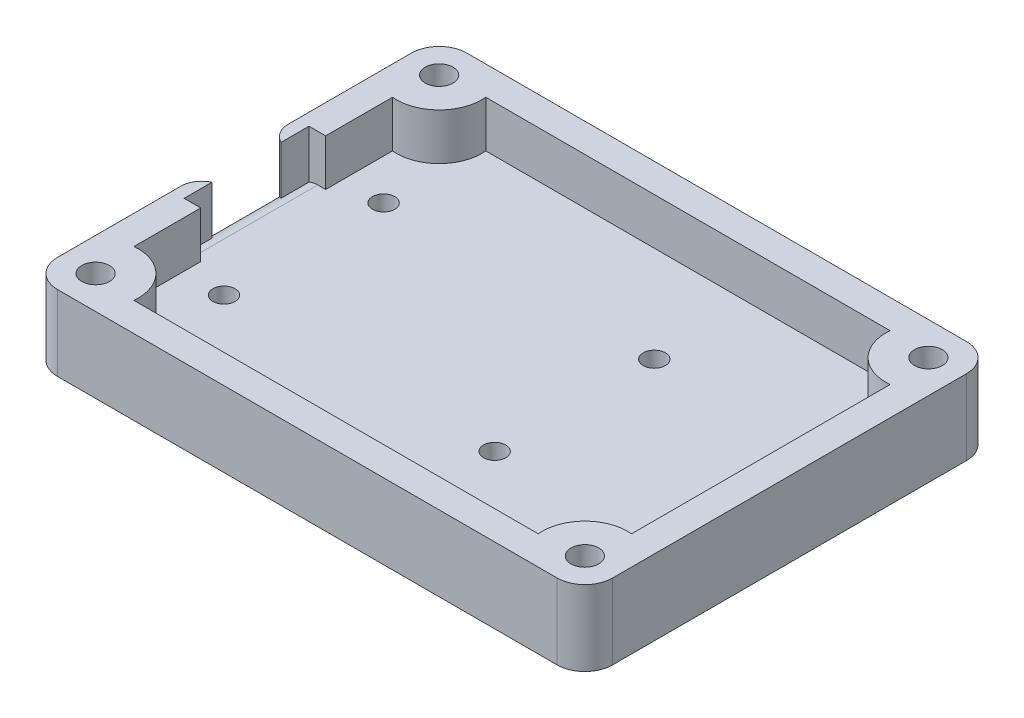
ISO-10303-21;
HEADER;
FILE_DESCRIPTION(('STEP AP214'),'2;1');
FILE_NAME('part.step','',(''),(''),'','','');
FILE_SCHEMA(('AUTOMOTIVE_DESIGN { 1 0 10303 214 1 1 1 1 }'));
ENDSEC;
DATA;
#1=APPLICATION_CONTEXT('core data for automotive mechanical design processes');
#2=APPLICATION_PROTOCOL_DEFINITION('international standard','automotive_design',2000,#1);
#3=PRODUCT_CONTEXT('',#1,'mechanical');
#4=PRODUCT('Part','Part','',(#3));
#5=PRODUCT_RELATED_PRODUCT_CATEGORY('part','',(#4));
#6=PRODUCT_DEFINITION_FORMATION('','',#4);
#7=PRODUCT_DEFINITION_CONTEXT('part definition',#1,'design');
#8=PRODUCT_DEFINITION('design','',#6,#7);
#9=PRODUCT_DEFINITION_SHAPE('','',#8);
#10=(LENGTH_UNIT() NAMED_UNIT(*) SI_UNIT(.MILLI.,.METRE.));
#11=(NAMED_UNIT(*) PLANE_ANGLE_UNIT() SI_UNIT($,.RADIAN.));
#12=(NAMED_UNIT(*) SI_UNIT($,.STERADIAN.) SOLID_ANGLE_UNIT());
#13=UNCERTAINTY_MEASURE_WITH_UNIT(LENGTH_MEASURE(1.E-05),#10,'distance_accuracy_value','');
#14=(GEOMETRIC_REPRESENTATION_CONTEXT(3) GLOBAL_UNCERTAINTY_ASSIGNED_CONTEXT((#13)) GLOBAL_UNIT_ASSIGNED_CONTEXT((#10,
#11,#12)) REPRESENTATION_CONTEXT('',''));
#15=CARTESIAN_POINT('',(0.,0.,0.));
#16=DIRECTION('',(0.,0.,1.));
#17=DIRECTION('',(1.,0.,0.));
#18=AXIS2_PLACEMENT_3D('',#15,#16,#17);
#19=CARTESIAN_POINT('',(-35.85,10.85,29.5));
#20=DIRECTION('',(1.,0.,0.));
#21=DIRECTION('',(0.,0.,-1.));
#22=AXIS2_PLACEMENT_3D('',#19,#20,#21);
#23=PLANE('',#22);
#24=DIRECTION('',(0.,1.,0.));
#25=VECTOR('',#24,1.);
#26=CARTESIAN_POINT('',(-35.85,4.15,9.));
#27=LINE('',#26,#25);
#28=CARTESIAN_POINT('',(-35.85,4.15,9.));
#29=VERTEX_POINT('',#28);
#30=CARTESIAN_POINT('',(-35.85,10.85,9.));
#31=VERTEX_POINT('',#30);
#32=EDGE_CURVE('E554',#29,#31,#27,.T.);
#33=ORIENTED_EDGE('',*,*,#32,.T.);
#34=DIRECTION('',(0.,0.,1.));
#35=VECTOR('',#34,1.);
#36=CARTESIAN_POINT('',(-35.85,10.85,0.));
#37=LINE('',#36,#35);
#38=CARTESIAN_POINT('',(-35.85,10.85,18.629338271069));
#39=VERTEX_POINT('',#38);
#40=EDGE_CURVE('E247',#31,#39,#37,.T.);
#41=ORIENTED_EDGE('',*,*,#40,.T.);
#42=DIRECTION('',(0.,1.,0.));
#43=VECTOR('',#42,1.);
#44=CARTESIAN_POINT('',(-35.85,2.,18.629338271069));
#45=LINE('',#44,#43);
#46=CARTESIAN_POINT('',(-35.85,4.15,18.629338271069));
#47=VERTEX_POINT('',#46);
#48=EDGE_CURVE('E281',#39,#47,#45,.F.);
#49=ORIENTED_EDGE('',*,*,#48,.T.);
#50=DIRECTION('',(0.,0.,1.));
#51=VECTOR('',#50,1.);
#52=CARTESIAN_POINT('',(-35.85,4.15,0.));
#53=LINE('',#52,#51);
#54=EDGE_CURVE('E234',#29,#47,#53,.T.);
#55=ORIENTED_EDGE('',*,*,#54,.F.);
#56=EDGE_LOOP('',(#33,#41,#49,#55));
#57=FACE_BOUND('',#56,.T.);
#58=ADVANCED_FACE('F35',(#57),#23,.T.);
#59=CARTESIAN_POINT('',(40.,10.85,29.5));
#60=DIRECTION('',(-1.,0.,0.));
#61=DIRECTION('',(0.,0.,1.));
#62=AXIS2_PLACEMENT_3D('',#59,#60,#61);
#63=PLANE('',#62);
#64=DIRECTION('',(0.,0.,-1.));
#65=VECTOR('',#64,1.);
#66=CARTESIAN_POINT('',(40.,0.,29.5));
#67=LINE('',#66,#65);
#68=CARTESIAN_POINT('',(40.,0.,25.5));
#69=VERTEX_POINT('',#68);
#70=CARTESIAN_POINT('',(40.,0.,-25.5));
#71=VERTEX_POINT('',#70);
#72=EDGE_CURVE('E318',#69,#71,#67,.T.);
#73=ORIENTED_EDGE('',*,*,#72,.T.);
#74=DIRECTION('',(0.,-1.,0.));
#75=VECTOR('',#74,1.);
#76=CARTESIAN_POINT('',(40.,10.85,-25.5));
#77=LINE('',#76,#75);
#78=CARTESIAN_POINT('',(40.,10.85,-25.5));
#79=VERTEX_POINT('',#78);
#80=EDGE_CURVE('E364',#71,#79,#77,.F.);
#81=ORIENTED_EDGE('',*,*,#80,.T.);
#82=DIRECTION('',(0.,0.,-1.));
#83=VECTOR('',#82,1.);
#84=CARTESIAN_POINT('',(40.,10.85,29.5));
#85=LINE('',#84,#83);
#86=CARTESIAN_POINT('',(40.,10.85,25.5));
#87=VERTEX_POINT('',#86);
#88=EDGE_CURVE('E321',#87,#79,#85,.T.);
#89=ORIENTED_EDGE('',*,*,#88,.F.);
#90=DIRECTION('',(0.,-1.,0.));
#91=VECTOR('',#90,1.);
#92=CARTESIAN_POINT('',(40.,10.85,25.5));
#93=LINE('',#92,#91);
#94=EDGE_CURVE('E361',#87,#69,#93,.T.);
#95=ORIENTED_EDGE('',*,*,#94,.T.);
#96=EDGE_LOOP('',(#73,#81,#89,#95));
#97=FACE_BOUND('',#96,.T.);
#98=ADVANCED_FACE('F515',(#97),#63,.F.);
#99=CARTESIAN_POINT('',(-40.,10.85,-29.5));
#100=DIRECTION('',(0.,0.,1.));
#101=DIRECTION('',(1.,0.,0.));
#102=AXIS2_PLACEMENT_3D('',#99,#100,#101);
#103=PLANE('',#102);
#104=DIRECTION('',(-1.,0.,0.));
#105=VECTOR('',#104,1.);
#106=CARTESIAN_POINT('',(-40.,10.85,-29.5));
#107=LINE('',#106,#105);
#108=CARTESIAN_POINT('',(36.,10.85,-29.5));
#109=VERTEX_POINT('',#108);
#110=CARTESIAN_POINT('',(-36.,10.85,-29.5));
#111=VERTEX_POINT('',#110);
#112=EDGE_CURVE('E324',#109,#111,#107,.T.);
#113=ORIENTED_EDGE('',*,*,#112,.F.);
#114=DIRECTION('',(0.,-1.,0.));
#115=VECTOR('',#114,1.);
#116=CARTESIAN_POINT('',(36.,10.85,-29.5));
#117=LINE('',#116,#115);
#118=CARTESIAN_POINT('',(36.,0.,-29.5));
#119=VERTEX_POINT('',#118);
#120=EDGE_CURVE('E350',#109,#119,#117,.T.);
#121=ORIENTED_EDGE('',*,*,#120,.T.);
#122=DIRECTION('',(-1.,0.,0.));
#123=VECTOR('',#122,1.);
#124=CARTESIAN_POINT('',(-40.,0.,-29.5));
#125=LINE('',#124,#123);
#126=CARTESIAN_POINT('',(-36.,0.,-29.5));
#127=VERTEX_POINT('',#126);
#128=EDGE_CURVE('E338',#119,#127,#125,.T.);
#129=ORIENTED_EDGE('',*,*,#128,.T.);
#130=DIRECTION('',(0.,-1.,0.));
#131=VECTOR('',#130,1.);
#132=CARTESIAN_POINT('',(-36.,10.85,-29.5));
#133=LINE('',#132,#131);
#134=EDGE_CURVE('E348',#127,#111,#133,.F.);
#135=ORIENTED_EDGE('',*,*,#134,.T.);
#136=EDGE_LOOP('',(#113,#121,#129,#135));
#137=FACE_BOUND('',#136,.T.);
#138=ADVANCED_FACE('F511',(#137),#103,.F.);
#139=CARTESIAN_POINT('',(-40.,10.85,29.5));
#140=DIRECTION('',(1.,0.,0.));
#141=DIRECTION('',(0.,0.,-1.));
#142=AXIS2_PLACEMENT_3D('',#139,#140,#141);
#143=PLANE('',#142);
#144=DIRECTION('',(0.,0.,1.));
#145=VECTOR('',#144,1.);
#146=CARTESIAN_POINT('',(-40.,1.15,29.5));
#147=LINE('',#146,#145);
#148=CARTESIAN_POINT('',(-40.,1.15,7.72717802865893));
#149=VERTEX_POINT('',#148);
#150=CARTESIAN_POINT('',(-40.,1.15,-7.72717802865893));
#151=VERTEX_POINT('',#150);
#152=EDGE_CURVE('E385',#149,#151,#147,.F.);
#153=ORIENTED_EDGE('',*,*,#152,.T.);
#154=DIRECTION('',(0.,1.,0.));
#155=VECTOR('',#154,1.);
#156=CARTESIAN_POINT('',(-40.,10.85,-7.72717802865893));
#157=LINE('',#156,#155);
#158=CARTESIAN_POINT('',(-40.,10.85,-7.72717802865893));
#159=VERTEX_POINT('',#158);
#160=EDGE_CURVE('E389',#151,#159,#157,.T.);
#161=ORIENTED_EDGE('',*,*,#160,.T.);
#162=DIRECTION('',(0.,0.,1.));
#163=VECTOR('',#162,1.);
#164=CARTESIAN_POINT('',(-40.,10.85,29.5));
#165=LINE('',#164,#163);
#166=CARTESIAN_POINT('',(-40.,10.85,-25.5));
#167=VERTEX_POINT('',#166);
#168=EDGE_CURVE('E329',#167,#159,#165,.T.);
#169=ORIENTED_EDGE('',*,*,#168,.F.);
#170=DIRECTION('',(0.,-1.,0.));
#171=VECTOR('',#170,1.);
#172=CARTESIAN_POINT('',(-40.,10.85,-25.5));
#173=LINE('',#172,#171);
#174=CARTESIAN_POINT('',(-40.,0.,-25.5));
#175=VERTEX_POINT('',#174);
#176=EDGE_CURVE('E379',#167,#175,#173,.T.);
#177=ORIENTED_EDGE('',*,*,#176,.T.);
#178=DIRECTION('',(0.,0.,1.));
#179=VECTOR('',#178,1.);
#180=CARTESIAN_POINT('',(-40.,0.,29.5));
#181=LINE('',#180,#179);
#182=CARTESIAN_POINT('',(-40.,0.,25.5));
#183=VERTEX_POINT('',#182);
#184=EDGE_CURVE('E341',#175,#183,#181,.T.);
#185=ORIENTED_EDGE('',*,*,#184,.T.);
#186=DIRECTION('',(0.,-1.,0.));
#187=VECTOR('',#186,1.);
#188=CARTESIAN_POINT('',(-40.,10.85,25.5));
#189=LINE('',#188,#187);
#190=CARTESIAN_POINT('',(-40.,10.85,25.5));
#191=VERTEX_POINT('',#190);
#192=EDGE_CURVE('E382',#183,#191,#189,.F.);
#193=ORIENTED_EDGE('',*,*,#192,.T.);
#194=CARTESIAN_POINT('',(-40.,10.85,7.72717802865892));
#195=VERTEX_POINT('',#194);
#196=EDGE_CURVE('E328',#195,#191,#165,.T.);
#197=ORIENTED_EDGE('',*,*,#196,.F.);
#198=DIRECTION('',(0.,-1.,0.));
#199=VECTOR('',#198,1.);
#200=CARTESIAN_POINT('',(-40.,10.85,7.72717802865892));
#201=LINE('',#200,#199);
#202=EDGE_CURVE('E387',#195,#149,#201,.T.);
#203=ORIENTED_EDGE('',*,*,#202,.T.);
#204=EDGE_LOOP('',(#153,#161,#169,#177,#185,#193,#197,#203));
#205=FACE_BOUND('',#204,.T.);
#206=ADVANCED_FACE('F507',(#205),#143,.F.);
#207=CARTESIAN_POINT('',(-40.,10.85,29.5));
#208=DIRECTION('',(0.,0.,-1.));
#209=DIRECTION('',(-1.,0.,0.));
#210=AXIS2_PLACEMENT_3D('',#207,#208,#209);
#211=PLANE('',#210);
#212=DIRECTION('',(1.,0.,0.));
#213=VECTOR('',#212,1.);
#214=CARTESIAN_POINT('',(-40.,0.,29.5));
#215=LINE('',#214,#213);
#216=CARTESIAN_POINT('',(-36.,0.,29.5));
#217=VERTEX_POINT('',#216);
#218=CARTESIAN_POINT('',(36.,0.,29.5));
#219=VERTEX_POINT('',#218);
#220=EDGE_CURVE('E325',#217,#219,#215,.T.);
#221=ORIENTED_EDGE('',*,*,#220,.T.);
#222=DIRECTION('',(0.,-1.,0.));
#223=VECTOR('',#222,1.);
#224=CARTESIAN_POINT('',(36.,10.85,29.5));
#225=LINE('',#224,#223);
#226=CARTESIAN_POINT('',(36.,10.85,29.5));
#227=VERTEX_POINT('',#226);
#228=EDGE_CURVE('E377',#219,#227,#225,.F.);
#229=ORIENTED_EDGE('',*,*,#228,.T.);
#230=DIRECTION('',(1.,0.,0.));
#231=VECTOR('',#230,1.);
#232=CARTESIAN_POINT('',(-40.,10.85,29.5));
#233=LINE('',#232,#231);
#234=CARTESIAN_POINT('',(-36.,10.85,29.5));
#235=VERTEX_POINT('',#234);
#236=EDGE_CURVE('E332',#235,#227,#233,.T.);
#237=ORIENTED_EDGE('',*,*,#236,.F.);
#238=DIRECTION('',(0.,-1.,0.));
#239=VECTOR('',#238,1.);
#240=CARTESIAN_POINT('',(-36.,10.85,29.5));
#241=LINE('',#240,#239);
#242=EDGE_CURVE('E374',#235,#217,#241,.T.);
#243=ORIENTED_EDGE('',*,*,#242,.T.);
#244=EDGE_LOOP('',(#221,#229,#237,#243));
#245=FACE_BOUND('',#244,.T.);
#246=ADVANCED_FACE('F500',(#245),#211,.F.);
#247=CARTESIAN_POINT('',(0.,10.85,0.));
#248=DIRECTION('',(0.,-1.,0.));
#249=DIRECTION('',(0.,0.,-1.));
#250=AXIS2_PLACEMENT_3D('',#247,#248,#249);
#251=PLANE('',#250);
#252=CARTESIAN_POINT('',(-35.25,10.85,24.75));
#253=DIRECTION('',(0.,1.,0.));
#254=DIRECTION('',(0.,0.,1.));
#255=AXIS2_PLACEMENT_3D('',#252,#253,#254);
#256=CIRCLE('',#255,2.);
#257=CARTESIAN_POINT('',(-35.25,10.85,26.75));
#258=VERTEX_POINT('',#257);
#259=EDGE_CURVE('E307',#258,#258,#256,.T.);
#260=ORIENTED_EDGE('',*,*,#259,.F.);
#261=EDGE_LOOP('',(#260));
#262=FACE_BOUND('',#261,.T.);
#263=CARTESIAN_POINT('',(35.25,10.85,-24.75));
#264=DIRECTION('',(0.,1.,0.));
#265=DIRECTION('',(0.,0.,1.));
#266=AXIS2_PLACEMENT_3D('',#263,#264,#265);
#267=CIRCLE('',#266,2.);
#268=CARTESIAN_POINT('',(35.25,10.85,-22.75));
#269=VERTEX_POINT('',#268);
#270=EDGE_CURVE('E300',#269,#269,#267,.T.);
#271=ORIENTED_EDGE('',*,*,#270,.F.);
#272=EDGE_LOOP('',(#271));
#273=FACE_BOUND('',#272,.T.);
#274=CARTESIAN_POINT('',(35.25,10.85,24.75));
#275=DIRECTION('',(0.,1.,0.));
#276=DIRECTION('',(0.,0.,1.));
#277=AXIS2_PLACEMENT_3D('',#274,#275,#276);
#278=CIRCLE('',#277,2.);
#279=CARTESIAN_POINT('',(35.25,10.85,26.75));
#280=VERTEX_POINT('',#279);
#281=EDGE_CURVE('E296',#280,#280,#278,.T.);
#282=ORIENTED_EDGE('',*,*,#281,.F.);
#283=EDGE_LOOP('',(#282));
#284=FACE_BOUND('',#283,.T.);
#285=CARTESIAN_POINT('',(-35.25,10.85,-24.75));
#286=DIRECTION('',(0.,1.,0.));
#287=DIRECTION('',(0.,0.,1.));
#288=AXIS2_PLACEMENT_3D('',#285,#286,#287);
#289=CIRCLE('',#288,2.);
#290=CARTESIAN_POINT('',(-35.25,10.85,-22.75));
#291=VERTEX_POINT('',#290);
#292=EDGE_CURVE('E306',#291,#291,#289,.T.);
#293=ORIENTED_EDGE('',*,*,#292,.F.);
#294=EDGE_LOOP('',(#293));
#295=FACE_BOUND('',#294,.T.);
#296=ORIENTED_EDGE('',*,*,#168,.T.);
#297=CARTESIAN_POINT('',(-37.,10.85,-7.72717802865893));
#298=DIRECTION('',(0.,-1.,0.));
#299=DIRECTION('',(0.,0.,-1.));
#300=AXIS2_PLACEMENT_3D('',#297,#298,#299);
#301=CIRCLE('',#300,3.);
#302=CARTESIAN_POINT('',(-38.25,10.85,-5.));
#303=VERTEX_POINT('',#302);
#304=EDGE_CURVE('E393',#159,#303,#301,.F.);
#305=ORIENTED_EDGE('',*,*,#304,.T.);
#306=DIRECTION('',(0.,0.,1.));
#307=VECTOR('',#306,1.);
#308=CARTESIAN_POINT('',(-38.25,10.85,-9.));
#309=LINE('',#308,#307);
#310=CARTESIAN_POINT('',(-38.25,10.85,-9.));
#311=VERTEX_POINT('',#310);
#312=EDGE_CURVE('E573',#311,#303,#309,.T.);
#313=ORIENTED_EDGE('',*,*,#312,.F.);
#314=DIRECTION('',(-1.,0.,0.));
#315=VECTOR('',#314,1.);
#316=CARTESIAN_POINT('',(-38.25,10.85,-9.));
#317=LINE('',#316,#315);
#318=CARTESIAN_POINT('',(-35.85,10.85,-9.));
#319=VERTEX_POINT('',#318);
#320=EDGE_CURVE('E570',#319,#311,#317,.T.);
#321=ORIENTED_EDGE('',*,*,#320,.F.);
#322=CARTESIAN_POINT('',(-35.85,10.85,-18.629338271069));
#323=VERTEX_POINT('',#322);
#324=EDGE_CURVE('E225',#323,#319,#37,.T.);
#325=ORIENTED_EDGE('',*,*,#324,.F.);
#326=CARTESIAN_POINT('',(-35.25,10.85,-24.75));
#327=DIRECTION('',(0.,-1.,0.));
#328=DIRECTION('',(0.,0.,-1.));
#329=AXIS2_PLACEMENT_3D('',#326,#327,#328);
#330=CIRCLE('',#329,6.15);
#331=CARTESIAN_POINT('',(-29.1293382710691,10.85,-25.35));
#332=VERTEX_POINT('',#331);
#333=EDGE_CURVE('E256',#323,#332,#330,.F.);
#334=ORIENTED_EDGE('',*,*,#333,.T.);
#335=DIRECTION('',(-1.,0.,0.));
#336=VECTOR('',#335,1.);
#337=CARTESIAN_POINT('',(0.,10.85,-25.35));
#338=LINE('',#337,#336);
#339=CARTESIAN_POINT('',(29.129338271069,10.85,-25.35));
#340=VERTEX_POINT('',#339);
#341=EDGE_CURVE('E244',#340,#332,#338,.T.);
#342=ORIENTED_EDGE('',*,*,#341,.F.);
#343=CARTESIAN_POINT('',(35.25,10.85,-24.75));
#344=DIRECTION('',(0.,-1.,0.));
#345=DIRECTION('',(0.,0.,-1.));
#346=AXIS2_PLACEMENT_3D('',#343,#344,#345);
#347=CIRCLE('',#346,6.15);
#348=CARTESIAN_POINT('',(35.85,10.85,-18.629338271069));
#349=VERTEX_POINT('',#348);
#350=EDGE_CURVE('E257',#340,#349,#347,.F.);
#351=ORIENTED_EDGE('',*,*,#350,.T.);
#352=DIRECTION('',(0.,0.,-1.));
#353=VECTOR('',#352,1.);
#354=CARTESIAN_POINT('',(35.85,10.85,0.));
#355=LINE('',#354,#353);
#356=CARTESIAN_POINT('',(35.85,10.85,18.629338271069));
#357=VERTEX_POINT('',#356);
#358=EDGE_CURVE('E237',#357,#349,#355,.T.);
#359=ORIENTED_EDGE('',*,*,#358,.F.);
#360=CARTESIAN_POINT('',(35.25,10.85,24.75));
#361=DIRECTION('',(0.,-1.,0.));
#362=DIRECTION('',(0.,0.,-1.));
#363=AXIS2_PLACEMENT_3D('',#360,#361,#362);
#364=CIRCLE('',#363,6.15);
#365=CARTESIAN_POINT('',(29.129338271069,10.85,25.35));
#366=VERTEX_POINT('',#365);
#367=EDGE_CURVE('E260',#357,#366,#364,.F.);
#368=ORIENTED_EDGE('',*,*,#367,.T.);
#369=DIRECTION('',(1.,0.,0.));
#370=VECTOR('',#369,1.);
#371=CARTESIAN_POINT('',(0.,10.85,25.35));
#372=LINE('',#371,#370);
#373=CARTESIAN_POINT('',(-29.1293382710691,10.85,25.35));
#374=VERTEX_POINT('',#373);
#375=EDGE_CURVE('E249',#374,#366,#372,.T.);
#376=ORIENTED_EDGE('',*,*,#375,.F.);
#377=CARTESIAN_POINT('',(-35.25,10.85,24.75));
#378=DIRECTION('',(0.,-1.,0.));
#379=DIRECTION('',(0.,0.,-1.));
#380=AXIS2_PLACEMENT_3D('',#377,#378,#379);
#381=CIRCLE('',#380,6.15);
#382=EDGE_CURVE('E253',#374,#39,#381,.F.);
#383=ORIENTED_EDGE('',*,*,#382,.T.);
#384=ORIENTED_EDGE('',*,*,#40,.F.);
#385=DIRECTION('',(1.,0.,0.));
#386=VECTOR('',#385,1.);
#387=CARTESIAN_POINT('',(-38.25,10.85,9.));
#388=LINE('',#387,#386);
#389=CARTESIAN_POINT('',(-38.25,10.85,9.));
#390=VERTEX_POINT('',#389);
#391=EDGE_CURVE('E217',#390,#31,#388,.T.);
#392=ORIENTED_EDGE('',*,*,#391,.F.);
#393=CARTESIAN_POINT('',(-38.25,10.85,5.));
#394=VERTEX_POINT('',#393);
#395=EDGE_CURVE('E572',#394,#390,#309,.T.);
#396=ORIENTED_EDGE('',*,*,#395,.F.);
#397=CARTESIAN_POINT('',(-37.,10.85,7.72717802865893));
#398=DIRECTION('',(0.,-1.,0.));
#399=DIRECTION('',(0.,0.,-1.));
#400=AXIS2_PLACEMENT_3D('',#397,#398,#399);
#401=CIRCLE('',#400,3.);
#402=EDGE_CURVE('E391',#394,#195,#401,.F.);
#403=ORIENTED_EDGE('',*,*,#402,.T.);
#404=ORIENTED_EDGE('',*,*,#196,.T.);
#405=CARTESIAN_POINT('',(-36.,10.85,25.5));
#406=DIRECTION('',(0.,-1.,0.));
#407=DIRECTION('',(0.,0.,-1.));
#408=AXIS2_PLACEMENT_3D('',#405,#406,#407);
#409=CIRCLE('',#408,4.);
#410=EDGE_CURVE('E368',#191,#235,#409,.F.);
#411=ORIENTED_EDGE('',*,*,#410,.T.);
#412=ORIENTED_EDGE('',*,*,#236,.T.);
#413=CARTESIAN_POINT('',(36.,10.85,25.5));
#414=DIRECTION('',(0.,-1.,0.));
#415=DIRECTION('',(0.,0.,-1.));
#416=AXIS2_PLACEMENT_3D('',#413,#414,#415);
#417=CIRCLE('',#416,4.);
#418=EDGE_CURVE('E370',#227,#87,#417,.F.);
#419=ORIENTED_EDGE('',*,*,#418,.T.);
#420=ORIENTED_EDGE('',*,*,#88,.T.);
#421=CARTESIAN_POINT('',(36.,10.85,-25.5));
#422=DIRECTION('',(0.,-1.,0.));
#423=DIRECTION('',(0.,0.,-1.));
#424=AXIS2_PLACEMENT_3D('',#421,#422,#423);
#425=CIRCLE('',#424,4.);
#426=EDGE_CURVE('E372',#79,#109,#425,.F.);
#427=ORIENTED_EDGE('',*,*,#426,.T.);
#428=ORIENTED_EDGE('',*,*,#112,.T.);
#429=CARTESIAN_POINT('',(-36.,10.85,-25.5));
#430=DIRECTION('',(0.,-1.,0.));
#431=DIRECTION('',(0.,0.,-1.));
#432=AXIS2_PLACEMENT_3D('',#429,#430,#431);
#433=CIRCLE('',#432,4.);
#434=EDGE_CURVE('E366',#111,#167,#433,.F.);
#435=ORIENTED_EDGE('',*,*,#434,.T.);
#436=EDGE_LOOP('',(#296,#305,#313,#321,#325,#334,#342,#351,#359,#368,#376,#383,#384,#392,#396,
#403,#404,#411,#412,#419,#420,#427,#428,#435));
#437=FACE_BOUND('',#436,.T.);
#438=ADVANCED_FACE('F497',(#262,#273,#284,#295,#437),#251,.F.);
#439=CARTESIAN_POINT('',(0.,0.,0.));
#440=DIRECTION('',(0.,-1.,0.));
#441=DIRECTION('',(0.,0.,-1.));
#442=AXIS2_PLACEMENT_3D('',#439,#440,#441);
#443=PLANE('',#442);
#444=CARTESIAN_POINT('',(-30.,0.,-11.5));
#445=DIRECTION('',(0.,-1.,0.));
#446=DIRECTION('',(0.,0.,-1.));
#447=AXIS2_PLACEMENT_3D('',#444,#445,#446);
#448=CIRCLE('',#447,1.6);
#449=CARTESIAN_POINT('',(-30.,0.,-13.1));
#450=VERTEX_POINT('',#449);
#451=EDGE_CURVE('E263',#450,#450,#448,.T.);
#452=ORIENTED_EDGE('',*,*,#451,.F.);
#453=EDGE_LOOP('',(#452));
#454=FACE_BOUND('',#453,.T.);
#455=CARTESIAN_POINT('',(8.99999999999999,0.,-11.5));
#456=DIRECTION('',(0.,-1.,0.));
#457=DIRECTION('',(0.,0.,-1.));
#458=AXIS2_PLACEMENT_3D('',#455,#456,#457);
#459=CIRCLE('',#458,1.6);
#460=CARTESIAN_POINT('',(8.99999999999999,0.,-13.1));
#461=VERTEX_POINT('',#460);
#462=EDGE_CURVE('E599',#461,#461,#459,.T.);
#463=ORIENTED_EDGE('',*,*,#462,.F.);
#464=EDGE_LOOP('',(#463));
#465=FACE_BOUND('',#464,.T.);
#466=CARTESIAN_POINT('',(8.99999999999999,0.,11.5));
#467=DIRECTION('',(0.,-1.,0.));
#468=DIRECTION('',(0.,0.,-1.));
#469=AXIS2_PLACEMENT_3D('',#466,#467,#468);
#470=CIRCLE('',#469,1.6);
#471=CARTESIAN_POINT('',(8.99999999999999,0.,9.9));
#472=VERTEX_POINT('',#471);
#473=EDGE_CURVE('E596',#472,#472,#470,.T.);
#474=ORIENTED_EDGE('',*,*,#473,.F.);
#475=EDGE_LOOP('',(#474));
#476=FACE_BOUND('',#475,.T.);
#477=CARTESIAN_POINT('',(-30.,0.,11.5));
#478=DIRECTION('',(0.,-1.,0.));
#479=DIRECTION('',(0.,0.,-1.));
#480=AXIS2_PLACEMENT_3D('',#477,#478,#479);
#481=CIRCLE('',#480,1.6);
#482=CARTESIAN_POINT('',(-30.,0.,9.9));
#483=VERTEX_POINT('',#482);
#484=EDGE_CURVE('E593',#483,#483,#481,.T.);
#485=ORIENTED_EDGE('',*,*,#484,.F.);
#486=EDGE_LOOP('',(#485));
#487=FACE_BOUND('',#486,.T.);
#488=ORIENTED_EDGE('',*,*,#128,.F.);
#489=CARTESIAN_POINT('',(36.,0.,-25.5));
#490=DIRECTION('',(0.,-1.,0.));
#491=DIRECTION('',(0.,0.,-1.));
#492=AXIS2_PLACEMENT_3D('',#489,#490,#491);
#493=CIRCLE('',#492,4.);
#494=EDGE_CURVE('E359',#119,#71,#493,.T.);
#495=ORIENTED_EDGE('',*,*,#494,.T.);
#496=ORIENTED_EDGE('',*,*,#72,.F.);
#497=CARTESIAN_POINT('',(36.,0.,25.5));
#498=DIRECTION('',(0.,-1.,0.));
#499=DIRECTION('',(0.,0.,-1.));
#500=AXIS2_PLACEMENT_3D('',#497,#498,#499);
#501=CIRCLE('',#500,4.);
#502=EDGE_CURVE('E357',#69,#219,#501,.T.);
#503=ORIENTED_EDGE('',*,*,#502,.T.);
#504=ORIENTED_EDGE('',*,*,#220,.F.);
#505=CARTESIAN_POINT('',(-36.,0.,25.5));
#506=DIRECTION('',(0.,-1.,0.));
#507=DIRECTION('',(0.,0.,-1.));
#508=AXIS2_PLACEMENT_3D('',#505,#506,#507);
#509=CIRCLE('',#508,4.);
#510=EDGE_CURVE('E355',#217,#183,#509,.T.);
#511=ORIENTED_EDGE('',*,*,#510,.T.);
#512=ORIENTED_EDGE('',*,*,#184,.F.);
#513=CARTESIAN_POINT('',(-36.,0.,-25.5));
#514=DIRECTION('',(0.,-1.,0.));
#515=DIRECTION('',(0.,0.,-1.));
#516=AXIS2_PLACEMENT_3D('',#513,#514,#515);
#517=CIRCLE('',#516,4.);
#518=EDGE_CURVE('E353',#175,#127,#517,.T.);
#519=ORIENTED_EDGE('',*,*,#518,.T.);
#520=EDGE_LOOP('',(#488,#495,#496,#503,#504,#511,#512,#519));
#521=FACE_BOUND('',#520,.T.);
#522=ADVANCED_FACE('F495',(#454,#465,#476,#487,#521),#443,.T.);
#523=CARTESIAN_POINT('',(-35.25,2.,-24.75));
#524=DIRECTION('',(0.,1.,0.));
#525=DIRECTION('',(0.,0.,1.));
#526=AXIS2_PLACEMENT_3D('',#523,#524,#525);
#527=CYLINDRICAL_SURFACE('',#526,2.);
#528=CARTESIAN_POINT('',(-35.25,2.,-24.75));
#529=DIRECTION('',(0.,1.,0.));
#530=DIRECTION('',(0.,0.,1.));
#531=AXIS2_PLACEMENT_3D('',#528,#529,#530);
#532=CIRCLE('',#531,2.);
#533=CARTESIAN_POINT('',(-35.25,2.,-22.75));
#534=VERTEX_POINT('',#533);
#535=EDGE_CURVE('E315',#534,#534,#532,.T.);
#536=ORIENTED_EDGE('',*,*,#535,.F.);
#537=EDGE_LOOP('',(#536));
#538=FACE_BOUND('',#537,.T.);
#539=ORIENTED_EDGE('',*,*,#292,.T.);
#540=EDGE_LOOP('',(#539));
#541=FACE_BOUND('',#540,.T.);
#542=ADVANCED_FACE('F491',(#538,#541),#527,.F.);
#543=CARTESIAN_POINT('',(-35.25,2.,-24.75));
#544=DIRECTION('',(0.,1.,0.));
#545=DIRECTION('',(0.,0.,1.));
#546=AXIS2_PLACEMENT_3D('',#543,#544,#545);
#547=PLANE('',#546);
#548=ORIENTED_EDGE('',*,*,#535,.T.);
#549=EDGE_LOOP('',(#548));
#550=FACE_BOUND('',#549,.T.);
#551=ADVANCED_FACE('F473',(#550),#547,.T.);
#552=CARTESIAN_POINT('',(35.25,2.,24.75));
#553=DIRECTION('',(0.,1.,0.));
#554=DIRECTION('',(0.,0.,1.));
#555=AXIS2_PLACEMENT_3D('',#552,#553,#554);
#556=CYLINDRICAL_SURFACE('',#555,2.);
#557=CARTESIAN_POINT('',(35.25,2.,24.75));
#558=DIRECTION('',(0.,1.,0.));
#559=DIRECTION('',(0.,0.,1.));
#560=AXIS2_PLACEMENT_3D('',#557,#558,#559);
#561=CIRCLE('',#560,2.);
#562=CARTESIAN_POINT('',(35.25,2.,26.75));
#563=VERTEX_POINT('',#562);
#564=EDGE_CURVE('E297',#563,#563,#561,.T.);
#565=ORIENTED_EDGE('',*,*,#564,.F.);
#566=EDGE_LOOP('',(#565));
#567=FACE_BOUND('',#566,.T.);
#568=ORIENTED_EDGE('',*,*,#281,.T.);
#569=EDGE_LOOP('',(#568));
#570=FACE_BOUND('',#569,.T.);
#571=ADVANCED_FACE('F469',(#567,#570),#556,.F.);
#572=CARTESIAN_POINT('',(35.25,2.,24.75));
#573=DIRECTION('',(0.,1.,0.));
#574=DIRECTION('',(0.,0.,1.));
#575=AXIS2_PLACEMENT_3D('',#572,#573,#574);
#576=PLANE('',#575);
#577=ORIENTED_EDGE('',*,*,#564,.T.);
#578=EDGE_LOOP('',(#577));
#579=FACE_BOUND('',#578,.T.);
#580=ADVANCED_FACE('F465',(#579),#576,.T.);
#581=CARTESIAN_POINT('',(35.25,2.,-24.75));
#582=DIRECTION('',(0.,1.,0.));
#583=DIRECTION('',(0.,0.,1.));
#584=AXIS2_PLACEMENT_3D('',#581,#582,#583);
#585=CYLINDRICAL_SURFACE('',#584,2.);
#586=CARTESIAN_POINT('',(35.25,2.,-24.75));
#587=DIRECTION('',(0.,1.,0.));
#588=DIRECTION('',(0.,0.,1.));
#589=AXIS2_PLACEMENT_3D('',#586,#587,#588);
#590=CIRCLE('',#589,2.);
#591=CARTESIAN_POINT('',(35.25,2.,-22.75));
#592=VERTEX_POINT('',#591);
#593=EDGE_CURVE('E310',#592,#592,#590,.T.);
#594=ORIENTED_EDGE('',*,*,#593,.F.);
#595=EDGE_LOOP('',(#594));
#596=FACE_BOUND('',#595,.T.);
#597=ORIENTED_EDGE('',*,*,#270,.T.);
#598=EDGE_LOOP('',(#597));
#599=FACE_BOUND('',#598,.T.);
#600=ADVANCED_FACE('F468',(#596,#599),#585,.F.);
#601=CARTESIAN_POINT('',(35.25,2.,-24.75));
#602=DIRECTION('',(0.,1.,0.));
#603=DIRECTION('',(0.,0.,1.));
#604=AXIS2_PLACEMENT_3D('',#601,#602,#603);
#605=PLANE('',#604);
#606=ORIENTED_EDGE('',*,*,#593,.T.);
#607=EDGE_LOOP('',(#606));
#608=FACE_BOUND('',#607,.T.);
#609=ADVANCED_FACE('F481',(#608),#605,.T.);
#610=CARTESIAN_POINT('',(-35.25,2.,24.75));
#611=DIRECTION('',(0.,1.,0.));
#612=DIRECTION('',(0.,0.,1.));
#613=AXIS2_PLACEMENT_3D('',#610,#611,#612);
#614=CYLINDRICAL_SURFACE('',#613,2.);
#615=CARTESIAN_POINT('',(-35.25,2.,24.75));
#616=DIRECTION('',(0.,1.,0.));
#617=DIRECTION('',(0.,0.,1.));
#618=AXIS2_PLACEMENT_3D('',#615,#616,#617);
#619=CIRCLE('',#618,2.);
#620=CARTESIAN_POINT('',(-35.25,2.,26.75));
#621=VERTEX_POINT('',#620);
#622=EDGE_CURVE('E303',#621,#621,#619,.T.);
#623=ORIENTED_EDGE('',*,*,#622,.F.);
#624=EDGE_LOOP('',(#623));
#625=FACE_BOUND('',#624,.T.);
#626=ORIENTED_EDGE('',*,*,#259,.T.);
#627=EDGE_LOOP('',(#626));
#628=FACE_BOUND('',#627,.T.);
#629=ADVANCED_FACE('F477',(#625,#628),#614,.F.);
#630=CARTESIAN_POINT('',(-35.25,2.,24.75));
#631=DIRECTION('',(0.,1.,0.));
#632=DIRECTION('',(0.,0.,1.));
#633=AXIS2_PLACEMENT_3D('',#630,#631,#632);
#634=PLANE('',#633);
#635=ORIENTED_EDGE('',*,*,#622,.T.);
#636=EDGE_LOOP('',(#635));
#637=FACE_BOUND('',#636,.T.);
#638=ADVANCED_FACE('F463',(#637),#634,.T.);
#639=CARTESIAN_POINT('',(-35.25,2.,24.75));
#640=DIRECTION('',(0.,1.,0.));
#641=DIRECTION('',(0.,0.,1.));
#642=AXIS2_PLACEMENT_3D('',#639,#640,#641);
#643=CYLINDRICAL_SURFACE('',#642,6.15);
#644=CARTESIAN_POINT('',(-35.25,4.15,24.75));
#645=DIRECTION('',(0.,-1.,0.));
#646=DIRECTION('',(0.,0.,-1.));
#647=AXIS2_PLACEMENT_3D('',#644,#645,#646);
#648=CIRCLE('',#647,6.15);
#649=CARTESIAN_POINT('',(-29.1293382710691,4.15,25.35));
#650=VERTEX_POINT('',#649);
#651=EDGE_CURVE('E293',#650,#47,#648,.F.);
#652=ORIENTED_EDGE('',*,*,#651,.T.);
#653=ORIENTED_EDGE('',*,*,#48,.F.);
#654=ORIENTED_EDGE('',*,*,#382,.F.);
#655=DIRECTION('',(0.,1.,0.));
#656=VECTOR('',#655,1.);
#657=CARTESIAN_POINT('',(-29.1293382710691,2.,25.35));
#658=LINE('',#657,#656);
#659=EDGE_CURVE('E284',#374,#650,#658,.F.);
#660=ORIENTED_EDGE('',*,*,#659,.T.);
#661=EDGE_LOOP('',(#652,#653,#654,#660));
#662=FACE_BOUND('',#661,.T.);
#663=ADVANCED_FACE('F459',(#662),#643,.T.);
#664=CARTESIAN_POINT('',(35.25,2.,-24.75));
#665=DIRECTION('',(0.,1.,0.));
#666=DIRECTION('',(0.,0.,1.));
#667=AXIS2_PLACEMENT_3D('',#664,#665,#666);
#668=CYLINDRICAL_SURFACE('',#667,6.15);
#669=CARTESIAN_POINT('',(35.25,4.15,-24.75));
#670=DIRECTION('',(0.,-1.,0.));
#671=DIRECTION('',(0.,0.,-1.));
#672=AXIS2_PLACEMENT_3D('',#669,#670,#671);
#673=CIRCLE('',#672,6.15);
#674=CARTESIAN_POINT('',(29.129338271069,4.15,-25.35));
#675=VERTEX_POINT('',#674);
#676=CARTESIAN_POINT('',(35.85,4.15,-18.629338271069));
#677=VERTEX_POINT('',#676);
#678=EDGE_CURVE('E290',#675,#677,#673,.F.);
#679=ORIENTED_EDGE('',*,*,#678,.T.);
#680=DIRECTION('',(0.,1.,0.));
#681=VECTOR('',#680,1.);
#682=CARTESIAN_POINT('',(35.85,2.,-18.629338271069));
#683=LINE('',#682,#681);
#684=EDGE_CURVE('E276',#349,#677,#683,.F.);
#685=ORIENTED_EDGE('',*,*,#684,.F.);
#686=ORIENTED_EDGE('',*,*,#350,.F.);
#687=DIRECTION('',(0.,1.,0.));
#688=VECTOR('',#687,1.);
#689=CARTESIAN_POINT('',(29.129338271069,2.,-25.35));
#690=LINE('',#689,#688);
#691=EDGE_CURVE('E278',#340,#675,#690,.F.);
#692=ORIENTED_EDGE('',*,*,#691,.T.);
#693=EDGE_LOOP('',(#679,#685,#686,#692));
#694=FACE_BOUND('',#693,.T.);
#695=ADVANCED_FACE('F450',(#694),#668,.T.);
#696=CARTESIAN_POINT('',(0.,4.15,0.));
#697=DIRECTION('',(0.,-1.,0.));
#698=DIRECTION('',(0.,0.,-1.));
#699=AXIS2_PLACEMENT_3D('',#696,#697,#698);
#700=PLANE('',#699);
#701=DIRECTION('',(-1.,0.,0.));
#702=VECTOR('',#701,1.);
#703=CARTESIAN_POINT('',(-38.25,4.15,-9.));
#704=LINE('',#703,#702);
#705=CARTESIAN_POINT('',(-35.85,4.15,-9.));
#706=VERTEX_POINT('',#705);
#707=CARTESIAN_POINT('',(-37.,4.15,-9.));
#708=VERTEX_POINT('',#707);
#709=EDGE_CURVE('E207',#706,#708,#704,.T.);
#710=ORIENTED_EDGE('',*,*,#709,.T.);
#711=DIRECTION('',(0.,0.,1.));
#712=VECTOR('',#711,1.);
#713=CARTESIAN_POINT('',(-37.,4.15,0.));
#714=LINE('',#713,#712);
#715=CARTESIAN_POINT('',(-37.,4.15,9.));
#716=VERTEX_POINT('',#715);
#717=EDGE_CURVE('E395',#708,#716,#714,.T.);
#718=ORIENTED_EDGE('',*,*,#717,.T.);
#719=DIRECTION('',(1.,0.,0.));
#720=VECTOR('',#719,1.);
#721=CARTESIAN_POINT('',(-38.25,4.15,9.));
#722=LINE('',#721,#720);
#723=EDGE_CURVE('E216',#716,#29,#722,.T.);
#724=ORIENTED_EDGE('',*,*,#723,.T.);
#725=ORIENTED_EDGE('',*,*,#54,.T.);
#726=ORIENTED_EDGE('',*,*,#651,.F.);
#727=DIRECTION('',(1.,0.,0.));
#728=VECTOR('',#727,1.);
#729=CARTESIAN_POINT('',(0.,4.15,25.35));
#730=LINE('',#729,#728);
#731=CARTESIAN_POINT('',(29.129338271069,4.15,25.35));
#732=VERTEX_POINT('',#731);
#733=EDGE_CURVE('E233',#650,#732,#730,.T.);
#734=ORIENTED_EDGE('',*,*,#733,.T.);
#735=CARTESIAN_POINT('',(35.25,4.15,24.75));
#736=DIRECTION('',(0.,-1.,0.));
#737=DIRECTION('',(0.,0.,-1.));
#738=AXIS2_PLACEMENT_3D('',#735,#736,#737);
#739=CIRCLE('',#738,6.15);
#740=CARTESIAN_POINT('',(35.85,4.15,18.629338271069));
#741=VERTEX_POINT('',#740);
#742=EDGE_CURVE('E288',#732,#741,#739,.T.);
#743=ORIENTED_EDGE('',*,*,#742,.T.);
#744=DIRECTION('',(0.,0.,-1.));
#745=VECTOR('',#744,1.);
#746=CARTESIAN_POINT('',(35.85,4.15,0.));
#747=LINE('',#746,#745);
#748=EDGE_CURVE('E266',#741,#677,#747,.T.);
#749=ORIENTED_EDGE('',*,*,#748,.T.);
#750=ORIENTED_EDGE('',*,*,#678,.F.);
#751=DIRECTION('',(-1.,0.,0.));
#752=VECTOR('',#751,1.);
#753=CARTESIAN_POINT('',(0.,4.15,-25.35));
#754=LINE('',#753,#752);
#755=CARTESIAN_POINT('',(-29.1293382710691,4.15,-25.35));
#756=VERTEX_POINT('',#755);
#757=EDGE_CURVE('E239',#675,#756,#754,.T.);
#758=ORIENTED_EDGE('',*,*,#757,.T.);
#759=CARTESIAN_POINT('',(-35.25,4.15,-24.75));
#760=DIRECTION('',(0.,-1.,0.));
#761=DIRECTION('',(0.,0.,-1.));
#762=AXIS2_PLACEMENT_3D('',#759,#760,#761);
#763=CIRCLE('',#762,6.15);
#764=CARTESIAN_POINT('',(-35.85,4.15,-18.629338271069));
#765=VERTEX_POINT('',#764);
#766=EDGE_CURVE('E231',#765,#756,#763,.F.);
#767=ORIENTED_EDGE('',*,*,#766,.F.);
#768=EDGE_CURVE('E223',#765,#706,#53,.T.);
#769=ORIENTED_EDGE('',*,*,#768,.T.);
#770=EDGE_LOOP('',(#710,#718,#724,#725,#726,#734,#743,#749,#750,#758,#767,#769));
#771=FACE_BOUND('',#770,.T.);
#772=CARTESIAN_POINT('',(-30.,4.15,11.5));
#773=DIRECTION('',(0.,1.,0.));
#774=DIRECTION('',(0.,0.,1.));
#775=AXIS2_PLACEMENT_3D('',#772,#773,#774);
#776=CIRCLE('',#775,1.6);
#777=CARTESIAN_POINT('',(-30.,4.15,13.1));
#778=VERTEX_POINT('',#777);
#779=EDGE_CURVE('E585',#778,#778,#776,.T.);
#780=ORIENTED_EDGE('',*,*,#779,.F.);
#781=EDGE_LOOP('',(#780));
#782=FACE_BOUND('',#781,.T.);
#783=CARTESIAN_POINT('',(8.99999999999999,4.15,11.5));
#784=DIRECTION('',(0.,1.,0.));
#785=DIRECTION('',(0.,0.,1.));
#786=AXIS2_PLACEMENT_3D('',#783,#784,#785);
#787=CIRCLE('',#786,1.6);
#788=CARTESIAN_POINT('',(8.99999999999999,4.15,13.1));
#789=VERTEX_POINT('',#788);
#790=EDGE_CURVE('E582',#789,#789,#787,.T.);
#791=ORIENTED_EDGE('',*,*,#790,.F.);
#792=EDGE_LOOP('',(#791));
#793=FACE_BOUND('',#792,.T.);
#794=CARTESIAN_POINT('',(8.99999999999999,4.15,-11.5));
#795=DIRECTION('',(0.,1.,0.));
#796=DIRECTION('',(0.,0.,1.));
#797=AXIS2_PLACEMENT_3D('',#794,#795,#796);
#798=CIRCLE('',#797,1.6);
#799=CARTESIAN_POINT('',(8.99999999999999,4.15,-9.9));
#800=VERTEX_POINT('',#799);
#801=EDGE_CURVE('E586',#800,#800,#798,.T.);
#802=ORIENTED_EDGE('',*,*,#801,.F.);
#803=EDGE_LOOP('',(#802));
#804=FACE_BOUND('',#803,.T.);
#805=CARTESIAN_POINT('',(-30.,4.15,-11.5));
#806=DIRECTION('',(0.,1.,0.));
#807=DIRECTION('',(0.,0.,1.));
#808=AXIS2_PLACEMENT_3D('',#805,#806,#807);
#809=CIRCLE('',#808,1.6);
#810=CARTESIAN_POINT('',(-30.,4.15,-9.9));
#811=VERTEX_POINT('',#810);
#812=EDGE_CURVE('E581',#811,#811,#809,.T.);
#813=ORIENTED_EDGE('',*,*,#812,.F.);
#814=EDGE_LOOP('',(#813));
#815=FACE_BOUND('',#814,.T.);
#816=ADVANCED_FACE('F227',(#771,#782,#793,#804,#815),#700,.F.);
#817=CARTESIAN_POINT('',(-35.25,2.,-24.75));
#818=DIRECTION('',(0.,1.,0.));
#819=DIRECTION('',(0.,0.,1.));
#820=AXIS2_PLACEMENT_3D('',#817,#818,#819);
#821=CYLINDRICAL_SURFACE('',#820,6.15);
#822=ORIENTED_EDGE('',*,*,#766,.T.);
#823=DIRECTION('',(0.,1.,0.));
#824=VECTOR('',#823,1.);
#825=CARTESIAN_POINT('',(-29.1293382710691,2.,-25.35));
#826=LINE('',#825,#824);
#827=EDGE_CURVE('E252',#332,#756,#826,.F.);
#828=ORIENTED_EDGE('',*,*,#827,.F.);
#829=ORIENTED_EDGE('',*,*,#333,.F.);
#830=DIRECTION('',(0.,1.,0.));
#831=VECTOR('',#830,1.);
#832=CARTESIAN_POINT('',(-35.85,2.,-18.629338271069));
#833=LINE('',#832,#831);
#834=EDGE_CURVE('E268',#323,#765,#833,.F.);
#835=ORIENTED_EDGE('',*,*,#834,.T.);
#836=EDGE_LOOP('',(#822,#828,#829,#835));
#837=FACE_BOUND('',#836,.T.);
#838=ADVANCED_FACE('F437',(#837),#821,.T.);
#839=CARTESIAN_POINT('',(35.85,10.85,29.5));
#840=DIRECTION('',(-1.,0.,0.));
#841=DIRECTION('',(0.,0.,1.));
#842=AXIS2_PLACEMENT_3D('',#839,#840,#841);
#843=PLANE('',#842);
#844=ORIENTED_EDGE('',*,*,#684,.T.);
#845=ORIENTED_EDGE('',*,*,#748,.F.);
#846=DIRECTION('',(0.,1.,0.));
#847=VECTOR('',#846,1.);
#848=CARTESIAN_POINT('',(35.85,2.,18.629338271069));
#849=LINE('',#848,#847);
#850=EDGE_CURVE('E270',#357,#741,#849,.F.);
#851=ORIENTED_EDGE('',*,*,#850,.F.);
#852=ORIENTED_EDGE('',*,*,#358,.T.);
#853=EDGE_LOOP('',(#844,#845,#851,#852));
#854=FACE_BOUND('',#853,.T.);
#855=ADVANCED_FACE('F433',(#854),#843,.T.);
#856=CARTESIAN_POINT('',(-40.,10.85,-25.35));
#857=DIRECTION('',(0.,0.,1.));
#858=DIRECTION('',(1.,0.,0.));
#859=AXIS2_PLACEMENT_3D('',#856,#857,#858);
#860=PLANE('',#859);
#861=ORIENTED_EDGE('',*,*,#341,.T.);
#862=ORIENTED_EDGE('',*,*,#827,.T.);
#863=ORIENTED_EDGE('',*,*,#757,.F.);
#864=ORIENTED_EDGE('',*,*,#691,.F.);
#865=EDGE_LOOP('',(#861,#862,#863,#864));
#866=FACE_BOUND('',#865,.T.);
#867=ADVANCED_FACE('F436',(#866),#860,.T.);
#868=DIRECTION('',(0.,1.,0.));
#869=VECTOR('',#868,1.);
#870=CARTESIAN_POINT('',(-35.85,4.15,-9.));
#871=LINE('',#870,#869);
#872=EDGE_CURVE('E210',#706,#319,#871,.T.);
#873=ORIENTED_EDGE('',*,*,#872,.F.);
#874=ORIENTED_EDGE('',*,*,#768,.F.);
#875=ORIENTED_EDGE('',*,*,#834,.F.);
#876=ORIENTED_EDGE('',*,*,#324,.T.);
#877=EDGE_LOOP('',(#873,#874,#875,#876));
#878=FACE_BOUND('',#877,.T.);
#879=ADVANCED_FACE('F222',(#878),#23,.T.);
#880=CARTESIAN_POINT('',(-40.,10.85,25.35));
#881=DIRECTION('',(0.,0.,-1.));
#882=DIRECTION('',(-1.,0.,0.));
#883=AXIS2_PLACEMENT_3D('',#880,#881,#882);
#884=PLANE('',#883);
#885=ORIENTED_EDGE('',*,*,#375,.T.);
#886=DIRECTION('',(0.,1.,0.));
#887=VECTOR('',#886,1.);
#888=CARTESIAN_POINT('',(29.129338271069,2.,25.35));
#889=LINE('',#888,#887);
#890=EDGE_CURVE('E273',#366,#732,#889,.F.);
#891=ORIENTED_EDGE('',*,*,#890,.T.);
#892=ORIENTED_EDGE('',*,*,#733,.F.);
#893=ORIENTED_EDGE('',*,*,#659,.F.);
#894=EDGE_LOOP('',(#885,#891,#892,#893));
#895=FACE_BOUND('',#894,.T.);
#896=ADVANCED_FACE('F444',(#895),#884,.T.);
#897=CARTESIAN_POINT('',(35.25,2.,24.75));
#898=DIRECTION('',(0.,1.,0.));
#899=DIRECTION('',(0.,0.,1.));
#900=AXIS2_PLACEMENT_3D('',#897,#898,#899);
#901=CYLINDRICAL_SURFACE('',#900,6.15);
#902=ORIENTED_EDGE('',*,*,#890,.F.);
#903=ORIENTED_EDGE('',*,*,#367,.F.);
#904=ORIENTED_EDGE('',*,*,#850,.T.);
#905=ORIENTED_EDGE('',*,*,#742,.F.);
#906=EDGE_LOOP('',(#902,#903,#904,#905));
#907=FACE_BOUND('',#906,.T.);
#908=ADVANCED_FACE('F431',(#907),#901,.T.);
#909=CARTESIAN_POINT('',(-30.,-4.7,11.5));
#910=DIRECTION('',(0.,1.,0.));
#911=DIRECTION('',(0.,0.,1.));
#912=AXIS2_PLACEMENT_3D('',#909,#910,#911);
#913=CYLINDRICAL_SURFACE('',#912,1.6);
#914=ORIENTED_EDGE('',*,*,#484,.T.);
#915=EDGE_LOOP('',(#914));
#916=FACE_BOUND('',#915,.T.);
#917=ORIENTED_EDGE('',*,*,#779,.T.);
#918=EDGE_LOOP('',(#917));
#919=FACE_BOUND('',#918,.T.);
#920=ADVANCED_FACE('F419',(#916,#919),#913,.F.);
#921=CARTESIAN_POINT('',(8.99999999999999,-4.7,11.5));
#922=DIRECTION('',(0.,1.,0.));
#923=DIRECTION('',(0.,0.,1.));
#924=AXIS2_PLACEMENT_3D('',#921,#922,#923);
#925=CYLINDRICAL_SURFACE('',#924,1.6);
#926=ORIENTED_EDGE('',*,*,#473,.T.);
#927=EDGE_LOOP('',(#926));
#928=FACE_BOUND('',#927,.T.);
#929=ORIENTED_EDGE('',*,*,#790,.T.);
#930=EDGE_LOOP('',(#929));
#931=FACE_BOUND('',#930,.T.);
#932=ADVANCED_FACE('F415',(#928,#931),#925,.F.);
#933=CARTESIAN_POINT('',(8.99999999999999,-4.7,-11.5));
#934=DIRECTION('',(0.,1.,0.));
#935=DIRECTION('',(0.,0.,1.));
#936=AXIS2_PLACEMENT_3D('',#933,#934,#935);
#937=CYLINDRICAL_SURFACE('',#936,1.6);
#938=ORIENTED_EDGE('',*,*,#462,.T.);
#939=EDGE_LOOP('',(#938));
#940=FACE_BOUND('',#939,.T.);
#941=ORIENTED_EDGE('',*,*,#801,.T.);
#942=EDGE_LOOP('',(#941));
#943=FACE_BOUND('',#942,.T.);
#944=ADVANCED_FACE('F418',(#940,#943),#937,.F.);
#945=CARTESIAN_POINT('',(-30.,-4.7,-11.5));
#946=DIRECTION('',(0.,1.,0.));
#947=DIRECTION('',(0.,0.,1.));
#948=AXIS2_PLACEMENT_3D('',#945,#946,#947);
#949=CYLINDRICAL_SURFACE('',#948,1.6);
#950=ORIENTED_EDGE('',*,*,#451,.T.);
#951=EDGE_LOOP('',(#950));
#952=FACE_BOUND('',#951,.T.);
#953=ORIENTED_EDGE('',*,*,#812,.T.);
#954=EDGE_LOOP('',(#953));
#955=FACE_BOUND('',#954,.T.);
#956=ADVANCED_FACE('F423',(#952,#955),#949,.F.);
#957=CARTESIAN_POINT('',(-38.25,4.15,-9.));
#958=DIRECTION('',(-1.,0.,0.));
#959=DIRECTION('',(0.,0.,1.));
#960=AXIS2_PLACEMENT_3D('',#957,#958,#959);
#961=PLANE('',#960);
#962=CARTESIAN_POINT('',(-38.25,4.15,-5.));
#963=CARTESIAN_POINT('',(-38.25,3.87717802865893,-5.));
#964=B_SPLINE_CURVE_WITH_KNOTS('',1,(#962,#963),.UNSPECIFIED.,.F.,.F.,(2,2),(0.,1.),.UNSPECIFIED.);
#965=CARTESIAN_POINT('',(-38.25,4.15,-5.));
#966=VERTEX_POINT('',#965);
#967=CARTESIAN_POINT('',(-38.25,3.87717802865893,-5.));
#968=VERTEX_POINT('',#967);
#969=EDGE_CURVE('E397',#966,#968,#964,.T.);
#970=ORIENTED_EDGE('',*,*,#969,.T.);
#971=DIRECTION('',(0.,0.,1.));
#972=VECTOR('',#971,1.);
#973=CARTESIAN_POINT('',(-38.25,3.87717802865893,-5.));
#974=LINE('',#973,#972);
#975=CARTESIAN_POINT('',(-38.25,3.87717802865893,-9.));
#976=VERTEX_POINT('',#975);
#977=EDGE_CURVE('E44',#968,#976,#974,.F.);
#978=ORIENTED_EDGE('',*,*,#977,.T.);
#979=DIRECTION('',(0.,1.,0.));
#980=VECTOR('',#979,1.);
#981=CARTESIAN_POINT('',(-38.25,4.15,-9.));
#982=LINE('',#981,#980);
#983=EDGE_CURVE('E51',#976,#311,#982,.T.);
#984=ORIENTED_EDGE('',*,*,#983,.T.);
#985=ORIENTED_EDGE('',*,*,#312,.T.);
#986=DIRECTION('',(0.,1.,0.));
#987=VECTOR('',#986,1.);
#988=CARTESIAN_POINT('',(-38.25,4.15,-5.));
#989=LINE('',#988,#987);
#990=EDGE_CURVE('E335',#966,#303,#989,.T.);
#991=ORIENTED_EDGE('',*,*,#990,.F.);
#992=EDGE_LOOP('',(#970,#978,#984,#985,#991));
#993=FACE_BOUND('',#992,.T.);
#994=ADVANCED_FACE('F427',(#993),#961,.F.);
#995=CARTESIAN_POINT('',(-38.25,4.15,-9.));
#996=DIRECTION('',(0.,0.,-1.));
#997=DIRECTION('',(-1.,0.,0.));
#998=AXIS2_PLACEMENT_3D('',#995,#996,#997);
#999=PLANE('',#998);
#1000=ORIENTED_EDGE('',*,*,#320,.T.);
#1001=ORIENTED_EDGE('',*,*,#983,.F.);
#1002=CARTESIAN_POINT('',(-37.,1.15,-9.));
#1003=DIRECTION('',(0.,0.,-1.));
#1004=DIRECTION('',(-1.,0.,0.));
#1005=AXIS2_PLACEMENT_3D('',#1002,#1003,#1004);
#1006=CIRCLE('',#1005,3.);
#1007=EDGE_CURVE('E11',#976,#708,#1006,.T.);
#1008=ORIENTED_EDGE('',*,*,#1007,.T.);
#1009=ORIENTED_EDGE('',*,*,#709,.F.);
#1010=ORIENTED_EDGE('',*,*,#872,.T.);
#1011=EDGE_LOOP('',(#1000,#1001,#1008,#1009,#1010));
#1012=FACE_BOUND('',#1011,.T.);
#1013=ADVANCED_FACE('F209',(#1012),#999,.F.);
#1014=ORIENTED_EDGE('',*,*,#395,.T.);
#1015=DIRECTION('',(0.,1.,0.));
#1016=VECTOR('',#1015,1.);
#1017=CARTESIAN_POINT('',(-38.25,4.15,9.));
#1018=LINE('',#1017,#1016);
#1019=CARTESIAN_POINT('',(-38.25,3.87717802865893,9.));
#1020=VERTEX_POINT('',#1019);
#1021=EDGE_CURVE('E59',#1020,#390,#1018,.T.);
#1022=ORIENTED_EDGE('',*,*,#1021,.F.);
#1023=DIRECTION('',(0.,0.,1.));
#1024=VECTOR('',#1023,1.);
#1025=CARTESIAN_POINT('',(-38.25,3.87717802865893,9.));
#1026=LINE('',#1025,#1024);
#1027=CARTESIAN_POINT('',(-38.25,3.87717802865893,5.));
#1028=VERTEX_POINT('',#1027);
#1029=EDGE_CURVE('E619',#1020,#1028,#1026,.F.);
#1030=ORIENTED_EDGE('',*,*,#1029,.T.);
#1031=CARTESIAN_POINT('',(-38.25,3.87717802865893,5.));
#1032=CARTESIAN_POINT('',(-38.25,4.15,5.));
#1033=B_SPLINE_CURVE_WITH_KNOTS('',1,(#1031,#1032),.UNSPECIFIED.,.F.,.F.,(2,2),(0.,1.),.UNSPECIFIED.);
#1034=CARTESIAN_POINT('',(-38.25,4.15,5.));
#1035=VERTEX_POINT('',#1034);
#1036=EDGE_CURVE('E401',#1028,#1035,#1033,.T.);
#1037=ORIENTED_EDGE('',*,*,#1036,.T.);
#1038=DIRECTION('',(0.,-1.,0.));
#1039=VECTOR('',#1038,1.);
#1040=CARTESIAN_POINT('',(-38.25,4.15,5.));
#1041=LINE('',#1040,#1039);
#1042=EDGE_CURVE('E559',#394,#1035,#1041,.T.);
#1043=ORIENTED_EDGE('',*,*,#1042,.F.);
#1044=EDGE_LOOP('',(#1014,#1022,#1030,#1037,#1043));
#1045=FACE_BOUND('',#1044,.T.);
#1046=ADVANCED_FACE('F630',(#1045),#961,.F.);
#1047=CARTESIAN_POINT('',(-38.25,4.15,9.));
#1048=DIRECTION('',(0.,0.,1.));
#1049=DIRECTION('',(1.,0.,0.));
#1050=AXIS2_PLACEMENT_3D('',#1047,#1048,#1049);
#1051=PLANE('',#1050);
#1052=ORIENTED_EDGE('',*,*,#391,.T.);
#1053=ORIENTED_EDGE('',*,*,#32,.F.);
#1054=ORIENTED_EDGE('',*,*,#723,.F.);
#1055=CARTESIAN_POINT('',(-37.,1.15,9.));
#1056=DIRECTION('',(0.,0.,1.));
#1057=DIRECTION('',(1.,0.,0.));
#1058=AXIS2_PLACEMENT_3D('',#1055,#1056,#1057);
#1059=CIRCLE('',#1058,3.);
#1060=EDGE_CURVE('E621',#716,#1020,#1059,.T.);
#1061=ORIENTED_EDGE('',*,*,#1060,.T.);
#1062=ORIENTED_EDGE('',*,*,#1021,.T.);
#1063=EDGE_LOOP('',(#1052,#1053,#1054,#1061,#1062));
#1064=FACE_BOUND('',#1063,.T.);
#1065=ADVANCED_FACE('F524',(#1064),#1051,.F.);
#1066=CARTESIAN_POINT('',(36.,10.85,-25.5));
#1067=DIRECTION('',(0.,-1.,0.));
#1068=DIRECTION('',(0.,0.,-1.));
#1069=AXIS2_PLACEMENT_3D('',#1066,#1067,#1068);
#1070=CYLINDRICAL_SURFACE('',#1069,4.);
#1071=ORIENTED_EDGE('',*,*,#426,.F.);
#1072=ORIENTED_EDGE('',*,*,#80,.F.);
#1073=ORIENTED_EDGE('',*,*,#494,.F.);
#1074=ORIENTED_EDGE('',*,*,#120,.F.);
#1075=EDGE_LOOP('',(#1071,#1072,#1073,#1074));
#1076=FACE_BOUND('',#1075,.T.);
#1077=ADVANCED_FACE('F520',(#1076),#1070,.T.);
#1078=CARTESIAN_POINT('',(36.,10.85,25.5));
#1079=DIRECTION('',(0.,-1.,0.));
#1080=DIRECTION('',(0.,0.,-1.));
#1081=AXIS2_PLACEMENT_3D('',#1078,#1079,#1080);
#1082=CYLINDRICAL_SURFACE('',#1081,4.);
#1083=ORIENTED_EDGE('',*,*,#418,.F.);
#1084=ORIENTED_EDGE('',*,*,#228,.F.);
#1085=ORIENTED_EDGE('',*,*,#502,.F.);
#1086=ORIENTED_EDGE('',*,*,#94,.F.);
#1087=EDGE_LOOP('',(#1083,#1084,#1085,#1086));
#1088=FACE_BOUND('',#1087,.T.);
#1089=ADVANCED_FACE('F523',(#1088),#1082,.T.);
#1090=CARTESIAN_POINT('',(-36.,10.85,25.5));
#1091=DIRECTION('',(0.,-1.,0.));
#1092=DIRECTION('',(0.,0.,-1.));
#1093=AXIS2_PLACEMENT_3D('',#1090,#1091,#1092);
#1094=CYLINDRICAL_SURFACE('',#1093,4.);
#1095=ORIENTED_EDGE('',*,*,#410,.F.);
#1096=ORIENTED_EDGE('',*,*,#192,.F.);
#1097=ORIENTED_EDGE('',*,*,#510,.F.);
#1098=ORIENTED_EDGE('',*,*,#242,.F.);
#1099=EDGE_LOOP('',(#1095,#1096,#1097,#1098));
#1100=FACE_BOUND('',#1099,.T.);
#1101=ADVANCED_FACE('F528',(#1100),#1094,.T.);
#1102=CARTESIAN_POINT('',(-36.,10.85,-25.5));
#1103=DIRECTION('',(0.,-1.,0.));
#1104=DIRECTION('',(0.,0.,-1.));
#1105=AXIS2_PLACEMENT_3D('',#1102,#1103,#1104);
#1106=CYLINDRICAL_SURFACE('',#1105,4.);
#1107=ORIENTED_EDGE('',*,*,#434,.F.);
#1108=ORIENTED_EDGE('',*,*,#134,.F.);
#1109=ORIENTED_EDGE('',*,*,#518,.F.);
#1110=ORIENTED_EDGE('',*,*,#176,.F.);
#1111=EDGE_LOOP('',(#1107,#1108,#1109,#1110));
#1112=FACE_BOUND('',#1111,.T.);
#1113=ADVANCED_FACE('F532',(#1112),#1106,.T.);
#1114=CARTESIAN_POINT('',(-37.,4.15,7.72717802865893));
#1115=DIRECTION('',(0.,-1.,0.));
#1116=DIRECTION('',(0.,0.,-1.));
#1117=AXIS2_PLACEMENT_3D('',#1114,#1115,#1116);
#1118=CYLINDRICAL_SURFACE('',#1117,3.);
#1119=ORIENTED_EDGE('',*,*,#1042,.T.);
#1120=ORIENTED_EDGE('',*,*,#1036,.F.);
#1121=CARTESIAN_POINT('',(-37.,1.15,7.72717802865893));
#1122=DIRECTION('',(0.,-0.707106781186547,-0.707106781186547));
#1123=DIRECTION('',(0.,-0.707106781186547,0.707106781186547));
#1124=AXIS2_PLACEMENT_3D('',#1121,#1122,#1123);
#1125=ELLIPSE('',#1124,4.24264068711928,3.);
#1126=EDGE_CURVE('E39',#149,#1028,#1125,.T.);
#1127=ORIENTED_EDGE('',*,*,#1126,.F.);
#1128=ORIENTED_EDGE('',*,*,#202,.F.);
#1129=ORIENTED_EDGE('',*,*,#402,.F.);
#1130=EDGE_LOOP('',(#1119,#1120,#1127,#1128,#1129));
#1131=FACE_BOUND('',#1130,.T.);
#1132=ADVANCED_FACE('F37',(#1131),#1118,.T.);
#1133=CARTESIAN_POINT('',(-37.,1.15,0.));
#1134=DIRECTION('',(0.,0.,1.));
#1135=DIRECTION('',(1.,0.,0.));
#1136=AXIS2_PLACEMENT_3D('',#1133,#1134,#1135);
#1137=CYLINDRICAL_SURFACE('',#1136,3.);
#1138=ORIENTED_EDGE('',*,*,#1007,.F.);
#1139=ORIENTED_EDGE('',*,*,#977,.F.);
#1140=CARTESIAN_POINT('',(-37.,1.15,-7.72717802865893));
#1141=DIRECTION('',(0.,0.707106781186547,-0.707106781186547));
#1142=DIRECTION('',(0.,0.707106781186547,0.707106781186547));
#1143=AXIS2_PLACEMENT_3D('',#1140,#1141,#1142);
#1144=ELLIPSE('',#1143,4.24264068711928,3.);
#1145=EDGE_CURVE('E616',#151,#968,#1144,.T.);
#1146=ORIENTED_EDGE('',*,*,#1145,.F.);
#1147=ORIENTED_EDGE('',*,*,#152,.F.);
#1148=ORIENTED_EDGE('',*,*,#1126,.T.);
#1149=ORIENTED_EDGE('',*,*,#1029,.F.);
#1150=ORIENTED_EDGE('',*,*,#1060,.F.);
#1151=ORIENTED_EDGE('',*,*,#717,.F.);
#1152=EDGE_LOOP('',(#1138,#1139,#1146,#1147,#1148,#1149,#1150,#1151));
#1153=FACE_BOUND('',#1152,.T.);
#1154=ADVANCED_FACE('F539',(#1153),#1137,.T.);
#1155=CARTESIAN_POINT('',(-37.,4.15,-7.72717802865893));
#1156=DIRECTION('',(0.,1.,0.));
#1157=DIRECTION('',(0.,0.,1.));
#1158=AXIS2_PLACEMENT_3D('',#1155,#1156,#1157);
#1159=CYLINDRICAL_SURFACE('',#1158,3.);
#1160=ORIENTED_EDGE('',*,*,#304,.F.);
#1161=ORIENTED_EDGE('',*,*,#160,.F.);
#1162=ORIENTED_EDGE('',*,*,#1145,.T.);
#1163=ORIENTED_EDGE('',*,*,#969,.F.);
#1164=ORIENTED_EDGE('',*,*,#990,.T.);
#1165=EDGE_LOOP('',(#1160,#1161,#1162,#1163,#1164));
#1166=FACE_BOUND('',#1165,.T.);
#1167=ADVANCED_FACE('F537',(#1166),#1159,.T.);
#1168=CLOSED_SHELL('',(#58,#98,#138,#206,#246,#438,#522,#542,#551,#571,#580,#600,#609,#629,#638,
#663,#695,#816,#838,#855,#867,#879,#896,#908,#920,#932,#944,#956,#994,#1013,#1046,#1065,#1077,
#1089,#1101,#1113,#1132,#1154,#1167));
#1169=MANIFOLD_SOLID_BREP('B2',#1168);
#1170=ADVANCED_BREP_SHAPE_REPRESENTATION('',(#18,#1169),#14);
#1171=SHAPE_DEFINITION_REPRESENTATION(#9,#1170);
ENDSEC;
END-ISO-10303-21;
